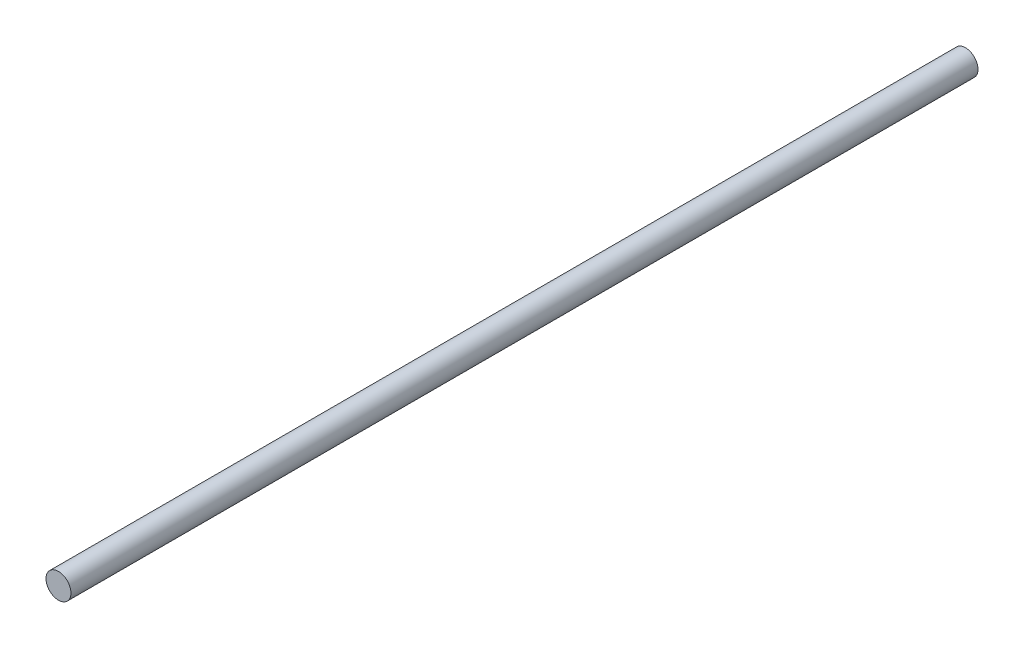
ISO-10303-21;
HEADER;
FILE_DESCRIPTION(('STEP AP214'),'2;1');
FILE_NAME('part.step','',(''),(''),'','','');
FILE_SCHEMA(('AUTOMOTIVE_DESIGN { 1 0 10303 214 1 1 1 1 }'));
ENDSEC;
DATA;
#1=APPLICATION_CONTEXT('core data for automotive mechanical design processes');
#2=APPLICATION_PROTOCOL_DEFINITION('international standard','automotive_design',2000,#1);
#3=PRODUCT_CONTEXT('',#1,'mechanical');
#4=PRODUCT('Part','Part','',(#3));
#5=PRODUCT_RELATED_PRODUCT_CATEGORY('part','',(#4));
#6=PRODUCT_DEFINITION_FORMATION('','',#4);
#7=PRODUCT_DEFINITION_CONTEXT('part definition',#1,'design');
#8=PRODUCT_DEFINITION('design','',#6,#7);
#9=PRODUCT_DEFINITION_SHAPE('','',#8);
#10=(LENGTH_UNIT() NAMED_UNIT(*) SI_UNIT(.MILLI.,.METRE.));
#11=(NAMED_UNIT(*) PLANE_ANGLE_UNIT() SI_UNIT($,.RADIAN.));
#12=(NAMED_UNIT(*) SI_UNIT($,.STERADIAN.) SOLID_ANGLE_UNIT());
#13=UNCERTAINTY_MEASURE_WITH_UNIT(LENGTH_MEASURE(1.E-05),#10,'distance_accuracy_value','');
#14=(GEOMETRIC_REPRESENTATION_CONTEXT(3) GLOBAL_UNCERTAINTY_ASSIGNED_CONTEXT((#13)) GLOBAL_UNIT_ASSIGNED_CONTEXT((#10,
#11,#12)) REPRESENTATION_CONTEXT('',''));
#15=CARTESIAN_POINT('',(0.,0.,0.));
#16=DIRECTION('',(0.,0.,1.));
#17=DIRECTION('',(1.,0.,0.));
#18=AXIS2_PLACEMENT_3D('',#15,#16,#17);
#19=CARTESIAN_POINT('',(0.,0.,218.));
#20=DIRECTION('',(0.,0.,-1.));
#21=DIRECTION('',(-1.,0.,0.));
#22=AXIS2_PLACEMENT_3D('',#19,#20,#21);
#23=CYLINDRICAL_SURFACE('',#22,6.);
#24=CARTESIAN_POINT('',(0.,0.,218.));
#25=DIRECTION('',(0.,0.,1.));
#26=DIRECTION('',(1.,0.,0.));
#27=AXIS2_PLACEMENT_3D('',#24,#25,#26);
#28=CIRCLE('',#27,6.);
#29=CARTESIAN_POINT('',(6.,0.,218.));
#30=VERTEX_POINT('',#29);
#31=EDGE_CURVE('E10',#30,#30,#28,.T.);
#32=ORIENTED_EDGE('',*,*,#31,.F.);
#33=EDGE_LOOP('',(#32));
#34=FACE_BOUND('',#33,.T.);
#35=CARTESIAN_POINT('',(0.,0.,-218.));
#36=DIRECTION('',(0.,0.,1.));
#37=DIRECTION('',(1.,0.,0.));
#38=AXIS2_PLACEMENT_3D('',#35,#36,#37);
#39=CIRCLE('',#38,6.);
#40=CARTESIAN_POINT('',(6.,0.,-218.));
#41=VERTEX_POINT('',#40);
#42=EDGE_CURVE('E34',#41,#41,#39,.T.);
#43=ORIENTED_EDGE('',*,*,#42,.T.);
#44=EDGE_LOOP('',(#43));
#45=FACE_BOUND('',#44,.T.);
#46=ADVANCED_FACE('F31',(#34,#45),#23,.T.);
#47=CARTESIAN_POINT('',(0.,0.,218.));
#48=DIRECTION('',(0.,0.,1.));
#49=DIRECTION('',(1.,0.,0.));
#50=AXIS2_PLACEMENT_3D('',#47,#48,#49);
#51=PLANE('',#50);
#52=ORIENTED_EDGE('',*,*,#31,.T.);
#53=EDGE_LOOP('',(#52));
#54=FACE_BOUND('',#53,.T.);
#55=ADVANCED_FACE('F46',(#54),#51,.T.);
#56=CARTESIAN_POINT('',(0.,0.,-218.));
#57=DIRECTION('',(0.,0.,1.));
#58=DIRECTION('',(1.,0.,0.));
#59=AXIS2_PLACEMENT_3D('',#56,#57,#58);
#60=PLANE('',#59);
#61=ORIENTED_EDGE('',*,*,#42,.F.);
#62=EDGE_LOOP('',(#61));
#63=FACE_BOUND('',#62,.T.);
#64=ADVANCED_FACE('F44',(#63),#60,.F.);
#65=CLOSED_SHELL('',(#46,#55,#64));
#66=MANIFOLD_SOLID_BREP('B2',#65);
#67=ADVANCED_BREP_SHAPE_REPRESENTATION('',(#18,#66),#14);
#68=SHAPE_DEFINITION_REPRESENTATION(#9,#67);
ENDSEC;
END-ISO-10303-21;
